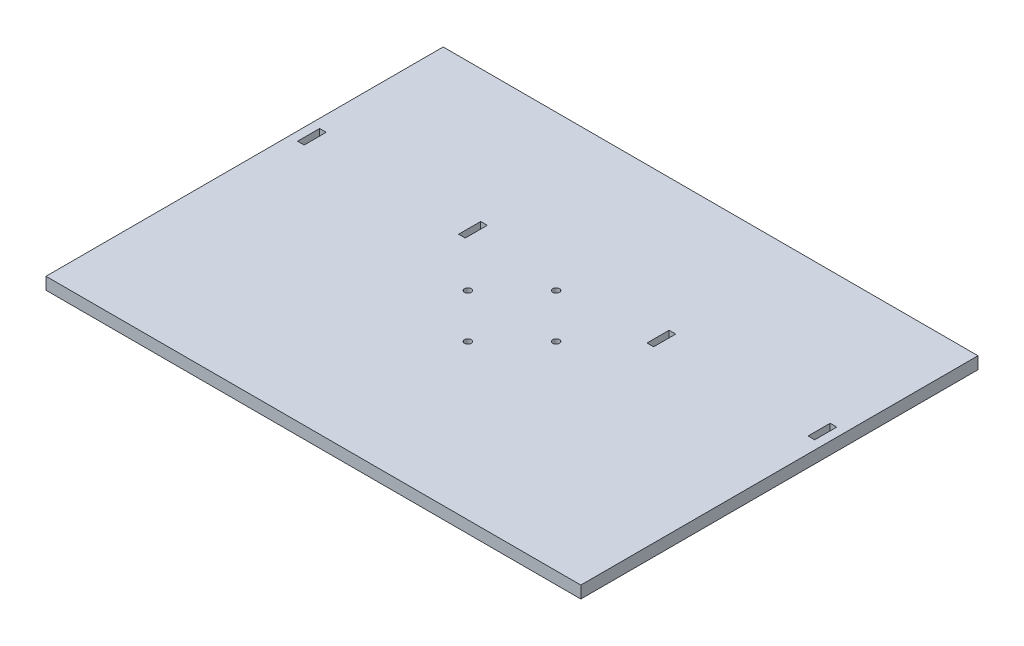
ISO-10303-21;
HEADER;
FILE_DESCRIPTION(('STEP AP214'),'2;1');
FILE_NAME('part.step','',(''),(''),'','','');
FILE_SCHEMA(('AUTOMOTIVE_DESIGN { 1 0 10303 214 1 1 1 1 }'));
ENDSEC;
DATA;
#1=APPLICATION_CONTEXT('core data for automotive mechanical design processes');
#2=APPLICATION_PROTOCOL_DEFINITION('international standard','automotive_design',2000,#1);
#3=PRODUCT_CONTEXT('',#1,'mechanical');
#4=PRODUCT('Part','Part','',(#3));
#5=PRODUCT_RELATED_PRODUCT_CATEGORY('part','',(#4));
#6=PRODUCT_DEFINITION_FORMATION('','',#4);
#7=PRODUCT_DEFINITION_CONTEXT('part definition',#1,'design');
#8=PRODUCT_DEFINITION('design','',#6,#7);
#9=PRODUCT_DEFINITION_SHAPE('','',#8);
#10=(LENGTH_UNIT() NAMED_UNIT(*) SI_UNIT(.MILLI.,.METRE.));
#11=(NAMED_UNIT(*) PLANE_ANGLE_UNIT() SI_UNIT($,.RADIAN.));
#12=(NAMED_UNIT(*) SI_UNIT($,.STERADIAN.) SOLID_ANGLE_UNIT());
#13=UNCERTAINTY_MEASURE_WITH_UNIT(LENGTH_MEASURE(1.E-05),#10,'distance_accuracy_value','');
#14=(GEOMETRIC_REPRESENTATION_CONTEXT(3) GLOBAL_UNCERTAINTY_ASSIGNED_CONTEXT((#13)) GLOBAL_UNIT_ASSIGNED_CONTEXT((#10,
#11,#12)) REPRESENTATION_CONTEXT('',''));
#15=CARTESIAN_POINT('',(0.,0.,0.));
#16=DIRECTION('',(0.,0.,1.));
#17=DIRECTION('',(1.,0.,0.));
#18=AXIS2_PLACEMENT_3D('',#15,#16,#17);
#19=CARTESIAN_POINT('',(0.,11.5,0.));
#20=DIRECTION('',(0.,-1.,0.));
#21=DIRECTION('',(0.,0.,-1.));
#22=AXIS2_PLACEMENT_3D('',#19,#20,#21);
#23=PLANE('',#22);
#24=DIRECTION('',(-1.,0.,0.));
#25=VECTOR('',#24,1.);
#26=CARTESIAN_POINT('',(0.,11.5,-20.));
#27=LINE('',#26,#25);
#28=CARTESIAN_POINT('',(-35.9388175044995,11.5,-20.));
#29=VERTEX_POINT('',#28);
#30=CARTESIAN_POINT('',(-38.9388175044995,11.5,-20.));
#31=VERTEX_POINT('',#30);
#32=EDGE_CURVE('E305',#29,#31,#27,.T.);
#33=ORIENTED_EDGE('',*,*,#32,.T.);
#34=DIRECTION('',(0.,0.,-1.));
#35=VECTOR('',#34,1.);
#36=CARTESIAN_POINT('',(-38.9388175044995,11.5,0.));
#37=LINE('',#36,#35);
#38=CARTESIAN_POINT('',(-38.9388175044995,11.5,-30.));
#39=VERTEX_POINT('',#38);
#40=EDGE_CURVE('E308',#31,#39,#37,.T.);
#41=ORIENTED_EDGE('',*,*,#40,.T.);
#42=DIRECTION('',(1.,0.,0.));
#43=VECTOR('',#42,1.);
#44=CARTESIAN_POINT('',(0.,11.5,-30.));
#45=LINE('',#44,#43);
#46=CARTESIAN_POINT('',(-35.9388175044995,11.5,-30.));
#47=VERTEX_POINT('',#46);
#48=EDGE_CURVE('E302',#39,#47,#45,.T.);
#49=ORIENTED_EDGE('',*,*,#48,.T.);
#50=DIRECTION('',(0.,0.,1.));
#51=VECTOR('',#50,1.);
#52=CARTESIAN_POINT('',(-35.9388175044995,11.5,0.));
#53=LINE('',#52,#51);
#54=EDGE_CURVE('E182',#47,#29,#53,.T.);
#55=ORIENTED_EDGE('',*,*,#54,.T.);
#56=EDGE_LOOP('',(#33,#41,#49,#55));
#57=FACE_BOUND('',#56,.T.);
#58=DIRECTION('',(1.,0.,0.));
#59=VECTOR('',#58,1.);
#60=CARTESIAN_POINT('',(0.,11.5,-30.));
#61=LINE('',#60,#59);
#62=CARTESIAN_POINT('',(119.442719099992,11.5,-30.));
#63=VERTEX_POINT('',#62);
#64=CARTESIAN_POINT('',(122.442719099992,11.5,-30.));
#65=VERTEX_POINT('',#64);
#66=EDGE_CURVE('E296',#63,#65,#61,.T.);
#67=ORIENTED_EDGE('',*,*,#66,.T.);
#68=DIRECTION('',(0.,0.,1.));
#69=VECTOR('',#68,1.);
#70=CARTESIAN_POINT('',(122.442719099992,11.5,0.));
#71=LINE('',#70,#69);
#72=CARTESIAN_POINT('',(122.442719099992,11.5,-20.));
#73=VERTEX_POINT('',#72);
#74=EDGE_CURVE('E299',#65,#73,#71,.T.);
#75=ORIENTED_EDGE('',*,*,#74,.T.);
#76=DIRECTION('',(-1.,0.,0.));
#77=VECTOR('',#76,1.);
#78=CARTESIAN_POINT('',(0.,11.5,-20.));
#79=LINE('',#78,#77);
#80=CARTESIAN_POINT('',(119.442719099992,11.5,-20.));
#81=VERTEX_POINT('',#80);
#82=EDGE_CURVE('E290',#73,#81,#79,.T.);
#83=ORIENTED_EDGE('',*,*,#82,.T.);
#84=DIRECTION('',(0.,0.,-1.));
#85=VECTOR('',#84,1.);
#86=CARTESIAN_POINT('',(119.442719099992,11.5,0.));
#87=LINE('',#86,#85);
#88=EDGE_CURVE('E293',#81,#63,#87,.T.);
#89=ORIENTED_EDGE('',*,*,#88,.T.);
#90=EDGE_LOOP('',(#67,#75,#83,#89));
#91=FACE_BOUND('',#90,.T.);
#92=DIRECTION('',(-1.,0.,0.));
#93=VECTOR('',#92,1.);
#94=CARTESIAN_POINT('',(0.,11.5,-20.));
#95=LINE('',#94,#93);
#96=CARTESIAN_POINT('',(37.0611824955005,11.5,-20.));
#97=VERTEX_POINT('',#96);
#98=CARTESIAN_POINT('',(34.0611824955005,11.5,-20.));
#99=VERTEX_POINT('',#98);
#100=EDGE_CURVE('E284',#97,#99,#95,.T.);
#101=ORIENTED_EDGE('',*,*,#100,.T.);
#102=DIRECTION('',(0.,0.,-1.));
#103=VECTOR('',#102,1.);
#104=CARTESIAN_POINT('',(34.0611824955005,11.5,0.));
#105=LINE('',#104,#103);
#106=CARTESIAN_POINT('',(34.0611824955005,11.5,-30.));
#107=VERTEX_POINT('',#106);
#108=EDGE_CURVE('E287',#99,#107,#105,.T.);
#109=ORIENTED_EDGE('',*,*,#108,.T.);
#110=DIRECTION('',(1.,0.,0.));
#111=VECTOR('',#110,1.);
#112=CARTESIAN_POINT('',(0.,11.5,-29.9999999999999));
#113=LINE('',#112,#111);
#114=CARTESIAN_POINT('',(37.0611824955005,11.5,-30.));
#115=VERTEX_POINT('',#114);
#116=EDGE_CURVE('E278',#107,#115,#113,.T.);
#117=ORIENTED_EDGE('',*,*,#116,.T.);
#118=DIRECTION('',(0.,0.,1.));
#119=VECTOR('',#118,1.);
#120=CARTESIAN_POINT('',(37.0611824955005,11.5,0.));
#121=LINE('',#120,#119);
#122=EDGE_CURVE('E281',#115,#97,#121,.T.);
#123=ORIENTED_EDGE('',*,*,#122,.T.);
#124=EDGE_LOOP('',(#101,#109,#117,#123));
#125=FACE_BOUND('',#124,.T.);
#126=DIRECTION('',(1.,0.,0.));
#127=VECTOR('',#126,1.);
#128=CARTESIAN_POINT('',(0.,11.5,-30.));
#129=LINE('',#128,#127);
#130=CARTESIAN_POINT('',(192.442719099992,11.5,-30.));
#131=VERTEX_POINT('',#130);
#132=CARTESIAN_POINT('',(195.442719099992,11.5,-30.));
#133=VERTEX_POINT('',#132);
#134=EDGE_CURVE('E272',#131,#133,#129,.T.);
#135=ORIENTED_EDGE('',*,*,#134,.T.);
#136=DIRECTION('',(0.,0.,1.));
#137=VECTOR('',#136,1.);
#138=CARTESIAN_POINT('',(195.442719099992,11.5,0.));
#139=LINE('',#138,#137);
#140=CARTESIAN_POINT('',(195.442719099992,11.5,-19.9999999999999));
#141=VERTEX_POINT('',#140);
#142=EDGE_CURVE('E275',#133,#141,#139,.T.);
#143=ORIENTED_EDGE('',*,*,#142,.T.);
#144=DIRECTION('',(-1.,0.,0.));
#145=VECTOR('',#144,1.);
#146=CARTESIAN_POINT('',(0.,11.5,-20.0000000000002));
#147=LINE('',#146,#145);
#148=CARTESIAN_POINT('',(192.442719099992,11.5,-20.));
#149=VERTEX_POINT('',#148);
#150=EDGE_CURVE('E206',#141,#149,#147,.T.);
#151=ORIENTED_EDGE('',*,*,#150,.T.);
#152=DIRECTION('',(0.,0.,-1.));
#153=VECTOR('',#152,1.);
#154=CARTESIAN_POINT('',(192.442719099991,11.5,5.34135844165705E-13));
#155=LINE('',#154,#153);
#156=EDGE_CURVE('E269',#149,#131,#155,.T.);
#157=ORIENTED_EDGE('',*,*,#156,.T.);
#158=EDGE_LOOP('',(#135,#143,#151,#157));
#159=FACE_BOUND('',#158,.T.);
#160=CARTESIAN_POINT('',(98.2519507977461,11.5,0.));
#161=DIRECTION('',(0.,-1.,0.));
#162=DIRECTION('',(0.,0.,-1.));
#163=AXIS2_PLACEMENT_3D('',#160,#161,#162);
#164=CIRCLE('',#163,1.5);
#165=CARTESIAN_POINT('',(98.2519507977461,11.5,-1.5));
#166=VERTEX_POINT('',#165);
#167=EDGE_CURVE('E312',#166,#166,#164,.T.);
#168=ORIENTED_EDGE('',*,*,#167,.T.);
#169=EDGE_LOOP('',(#168));
#170=FACE_BOUND('',#169,.T.);
#171=CARTESIAN_POINT('',(78.251950797746,11.5,-20.));
#172=DIRECTION('',(0.,-1.,0.));
#173=DIRECTION('',(0.,0.,-1.));
#174=AXIS2_PLACEMENT_3D('',#171,#172,#173);
#175=CIRCLE('',#174,1.5);
#176=CARTESIAN_POINT('',(78.251950797746,11.5,-21.5));
#177=VERTEX_POINT('',#176);
#178=EDGE_CURVE('E319',#177,#177,#175,.T.);
#179=ORIENTED_EDGE('',*,*,#178,.T.);
#180=EDGE_LOOP('',(#179));
#181=FACE_BOUND('',#180,.T.);
#182=CARTESIAN_POINT('',(58.2519507977461,11.5,0.));
#183=DIRECTION('',(0.,-1.,0.));
#184=DIRECTION('',(0.,0.,-1.));
#185=AXIS2_PLACEMENT_3D('',#182,#183,#184);
#186=CIRCLE('',#185,1.5);
#187=CARTESIAN_POINT('',(58.2519507977461,11.5,-1.49999999999999));
#188=VERTEX_POINT('',#187);
#189=EDGE_CURVE('E322',#188,#188,#186,.T.);
#190=ORIENTED_EDGE('',*,*,#189,.T.);
#191=EDGE_LOOP('',(#190));
#192=FACE_BOUND('',#191,.T.);
#193=CARTESIAN_POINT('',(78.2519507977461,11.5,20.));
#194=DIRECTION('',(0.,-1.,0.));
#195=DIRECTION('',(0.,0.,-1.));
#196=AXIS2_PLACEMENT_3D('',#193,#194,#195);
#197=CIRCLE('',#196,1.5);
#198=CARTESIAN_POINT('',(78.2519507977461,11.5,18.5));
#199=VERTEX_POINT('',#198);
#200=EDGE_CURVE('E328',#199,#199,#197,.T.);
#201=ORIENTED_EDGE('',*,*,#200,.T.);
#202=EDGE_LOOP('',(#201));
#203=FACE_BOUND('',#202,.T.);
#204=DIRECTION('',(0.,0.,1.));
#205=VECTOR('',#204,1.);
#206=CARTESIAN_POINT('',(-42.9388175044995,11.5,90.));
#207=LINE('',#206,#205);
#208=CARTESIAN_POINT('',(-42.9388175044995,11.5,-90.));
#209=VERTEX_POINT('',#208);
#210=CARTESIAN_POINT('',(-42.9388175044995,11.5,90.));
#211=VERTEX_POINT('',#210);
#212=EDGE_CURVE('E336',#209,#211,#207,.T.);
#213=ORIENTED_EDGE('',*,*,#212,.T.);
#214=DIRECTION('',(1.,0.,0.));
#215=VECTOR('',#214,1.);
#216=CARTESIAN_POINT('',(-42.9388175044995,11.5,90.));
#217=LINE('',#216,#215);
#218=CARTESIAN_POINT('',(199.442719099992,11.5,90.));
#219=VERTEX_POINT('',#218);
#220=EDGE_CURVE('E339',#211,#219,#217,.T.);
#221=ORIENTED_EDGE('',*,*,#220,.T.);
#222=DIRECTION('',(0.,0.,-1.));
#223=VECTOR('',#222,1.);
#224=CARTESIAN_POINT('',(199.442719099992,11.5,90.));
#225=LINE('',#224,#223);
#226=CARTESIAN_POINT('',(199.442719099992,11.5,-90.));
#227=VERTEX_POINT('',#226);
#228=EDGE_CURVE('E342',#219,#227,#225,.T.);
#229=ORIENTED_EDGE('',*,*,#228,.T.);
#230=DIRECTION('',(-1.,0.,0.));
#231=VECTOR('',#230,1.);
#232=CARTESIAN_POINT('',(-42.9388175044995,11.5,-90.));
#233=LINE('',#232,#231);
#234=EDGE_CURVE('E344',#227,#209,#233,.T.);
#235=ORIENTED_EDGE('',*,*,#234,.T.);
#236=EDGE_LOOP('',(#213,#221,#229,#235));
#237=FACE_BOUND('',#236,.T.);
#238=ADVANCED_FACE('F40',(#57,#91,#125,#159,#170,#181,#192,#203,#237),#23,.F.);
#239=CARTESIAN_POINT('',(-42.9388175044995,11.5,-90.));
#240=DIRECTION('',(0.,0.,1.));
#241=DIRECTION('',(1.,0.,0.));
#242=AXIS2_PLACEMENT_3D('',#239,#240,#241);
#243=PLANE('',#242);
#244=DIRECTION('',(-1.,0.,0.));
#245=VECTOR('',#244,1.);
#246=CARTESIAN_POINT('',(-42.9388175044995,6.,-90.));
#247=LINE('',#246,#245);
#248=CARTESIAN_POINT('',(199.442719099992,6.,-90.));
#249=VERTEX_POINT('',#248);
#250=CARTESIAN_POINT('',(-42.9388175044995,6.,-90.));
#251=VERTEX_POINT('',#250);
#252=EDGE_CURVE('E340',#249,#251,#247,.T.);
#253=ORIENTED_EDGE('',*,*,#252,.T.);
#254=DIRECTION('',(0.,-1.,0.));
#255=VECTOR('',#254,1.);
#256=CARTESIAN_POINT('',(-42.9388175044995,11.5,-90.));
#257=LINE('',#256,#255);
#258=EDGE_CURVE('E345',#209,#251,#257,.T.);
#259=ORIENTED_EDGE('',*,*,#258,.F.);
#260=ORIENTED_EDGE('',*,*,#234,.F.);
#261=DIRECTION('',(0.,-1.,0.));
#262=VECTOR('',#261,1.);
#263=CARTESIAN_POINT('',(199.442719099992,11.5,-90.));
#264=LINE('',#263,#262);
#265=EDGE_CURVE('E353',#227,#249,#264,.T.);
#266=ORIENTED_EDGE('',*,*,#265,.T.);
#267=EDGE_LOOP('',(#253,#259,#260,#266));
#268=FACE_BOUND('',#267,.T.);
#269=ADVANCED_FACE('F377',(#268),#243,.F.);
#270=CARTESIAN_POINT('',(199.442719099992,11.5,90.));
#271=DIRECTION('',(-1.,0.,0.));
#272=DIRECTION('',(0.,0.,1.));
#273=AXIS2_PLACEMENT_3D('',#270,#271,#272);
#274=PLANE('',#273);
#275=DIRECTION('',(0.,0.,-1.));
#276=VECTOR('',#275,1.);
#277=CARTESIAN_POINT('',(199.442719099992,6.,90.));
#278=LINE('',#277,#276);
#279=CARTESIAN_POINT('',(199.442719099992,6.,90.));
#280=VERTEX_POINT('',#279);
#281=EDGE_CURVE('E348',#280,#249,#278,.T.);
#282=ORIENTED_EDGE('',*,*,#281,.T.);
#283=ORIENTED_EDGE('',*,*,#265,.F.);
#284=ORIENTED_EDGE('',*,*,#228,.F.);
#285=DIRECTION('',(0.,-1.,0.));
#286=VECTOR('',#285,1.);
#287=CARTESIAN_POINT('',(199.442719099992,11.5,90.));
#288=LINE('',#287,#286);
#289=EDGE_CURVE('E355',#219,#280,#288,.T.);
#290=ORIENTED_EDGE('',*,*,#289,.T.);
#291=EDGE_LOOP('',(#282,#283,#284,#290));
#292=FACE_BOUND('',#291,.T.);
#293=ADVANCED_FACE('F374',(#292),#274,.F.);
#294=CARTESIAN_POINT('',(-42.9388175044995,11.5,90.));
#295=DIRECTION('',(0.,0.,-1.));
#296=DIRECTION('',(-1.,0.,0.));
#297=AXIS2_PLACEMENT_3D('',#294,#295,#296);
#298=PLANE('',#297);
#299=DIRECTION('',(1.,0.,0.));
#300=VECTOR('',#299,1.);
#301=CARTESIAN_POINT('',(-42.9388175044995,6.,90.));
#302=LINE('',#301,#300);
#303=CARTESIAN_POINT('',(-42.9388175044995,6.,90.));
#304=VERTEX_POINT('',#303);
#305=EDGE_CURVE('E315',#304,#280,#302,.T.);
#306=ORIENTED_EDGE('',*,*,#305,.T.);
#307=ORIENTED_EDGE('',*,*,#289,.F.);
#308=ORIENTED_EDGE('',*,*,#220,.F.);
#309=DIRECTION('',(0.,-1.,0.));
#310=VECTOR('',#309,1.);
#311=CARTESIAN_POINT('',(-42.9388175044995,11.5,90.));
#312=LINE('',#311,#310);
#313=EDGE_CURVE('E44',#211,#304,#312,.T.);
#314=ORIENTED_EDGE('',*,*,#313,.T.);
#315=EDGE_LOOP('',(#306,#307,#308,#314));
#316=FACE_BOUND('',#315,.T.);
#317=ADVANCED_FACE('F364',(#316),#298,.F.);
#318=CARTESIAN_POINT('',(-42.9388175044995,11.5,90.));
#319=DIRECTION('',(1.,0.,0.));
#320=DIRECTION('',(0.,0.,-1.));
#321=AXIS2_PLACEMENT_3D('',#318,#319,#320);
#322=PLANE('',#321);
#323=ORIENTED_EDGE('',*,*,#258,.T.);
#324=DIRECTION('',(0.,0.,1.));
#325=VECTOR('',#324,1.);
#326=CARTESIAN_POINT('',(-42.9388175044995,6.,90.));
#327=LINE('',#326,#325);
#328=EDGE_CURVE('E11',#251,#304,#327,.T.);
#329=ORIENTED_EDGE('',*,*,#328,.T.);
#330=ORIENTED_EDGE('',*,*,#313,.F.);
#331=ORIENTED_EDGE('',*,*,#212,.F.);
#332=EDGE_LOOP('',(#323,#329,#330,#331));
#333=FACE_BOUND('',#332,.T.);
#334=ADVANCED_FACE('F42',(#333),#322,.F.);
#335=CARTESIAN_POINT('',(0.,6.,0.));
#336=DIRECTION('',(0.,-1.,0.));
#337=DIRECTION('',(0.,0.,-1.));
#338=AXIS2_PLACEMENT_3D('',#335,#336,#337);
#339=PLANE('',#338);
#340=DIRECTION('',(0.,0.,-1.));
#341=VECTOR('',#340,1.);
#342=CARTESIAN_POINT('',(-38.9388175044995,6.,-20.));
#343=LINE('',#342,#341);
#344=CARTESIAN_POINT('',(-38.9388175044995,6.,-20.));
#345=VERTEX_POINT('',#344);
#346=CARTESIAN_POINT('',(-38.9388175044995,6.,-30.));
#347=VERTEX_POINT('',#346);
#348=EDGE_CURVE('E194',#345,#347,#343,.T.);
#349=ORIENTED_EDGE('',*,*,#348,.F.);
#350=DIRECTION('',(-1.,0.,0.));
#351=VECTOR('',#350,1.);
#352=CARTESIAN_POINT('',(-38.9388175044995,6.,-20.));
#353=LINE('',#352,#351);
#354=CARTESIAN_POINT('',(-35.9388175044995,6.,-20.));
#355=VERTEX_POINT('',#354);
#356=EDGE_CURVE('E199',#355,#345,#353,.T.);
#357=ORIENTED_EDGE('',*,*,#356,.F.);
#358=DIRECTION('',(0.,0.,1.));
#359=VECTOR('',#358,1.);
#360=CARTESIAN_POINT('',(-35.9388175044995,6.,-20.));
#361=LINE('',#360,#359);
#362=CARTESIAN_POINT('',(-35.9388175044995,6.,-30.));
#363=VERTEX_POINT('',#362);
#364=EDGE_CURVE('E179',#363,#355,#361,.T.);
#365=ORIENTED_EDGE('',*,*,#364,.F.);
#366=DIRECTION('',(1.,0.,0.));
#367=VECTOR('',#366,1.);
#368=CARTESIAN_POINT('',(-38.9388175044995,6.,-30.));
#369=LINE('',#368,#367);
#370=EDGE_CURVE('E189',#347,#363,#369,.T.);
#371=ORIENTED_EDGE('',*,*,#370,.F.);
#372=EDGE_LOOP('',(#349,#357,#365,#371));
#373=FACE_BOUND('',#372,.T.);
#374=DIRECTION('',(0.,0.,1.));
#375=VECTOR('',#374,1.);
#376=CARTESIAN_POINT('',(122.442719099992,6.,-30.));
#377=LINE('',#376,#375);
#378=CARTESIAN_POINT('',(122.442719099992,6.,-30.));
#379=VERTEX_POINT('',#378);
#380=CARTESIAN_POINT('',(122.442719099992,6.,-20.));
#381=VERTEX_POINT('',#380);
#382=EDGE_CURVE('E209',#379,#381,#377,.T.);
#383=ORIENTED_EDGE('',*,*,#382,.F.);
#384=DIRECTION('',(1.,0.,0.));
#385=VECTOR('',#384,1.);
#386=CARTESIAN_POINT('',(122.442719099992,6.,-30.));
#387=LINE('',#386,#385);
#388=CARTESIAN_POINT('',(119.442719099992,6.,-30.));
#389=VERTEX_POINT('',#388);
#390=EDGE_CURVE('E216',#389,#379,#387,.T.);
#391=ORIENTED_EDGE('',*,*,#390,.F.);
#392=DIRECTION('',(0.,0.,-1.));
#393=VECTOR('',#392,1.);
#394=CARTESIAN_POINT('',(119.442719099992,6.,-30.));
#395=LINE('',#394,#393);
#396=CARTESIAN_POINT('',(119.442719099992,6.,-20.));
#397=VERTEX_POINT('',#396);
#398=EDGE_CURVE('E213',#397,#389,#395,.T.);
#399=ORIENTED_EDGE('',*,*,#398,.F.);
#400=DIRECTION('',(-1.,0.,0.));
#401=VECTOR('',#400,1.);
#402=CARTESIAN_POINT('',(122.442719099992,6.,-20.));
#403=LINE('',#402,#401);
#404=EDGE_CURVE('E211',#381,#397,#403,.T.);
#405=ORIENTED_EDGE('',*,*,#404,.F.);
#406=EDGE_LOOP('',(#383,#391,#399,#405));
#407=FACE_BOUND('',#406,.T.);
#408=DIRECTION('',(0.,0.,-1.));
#409=VECTOR('',#408,1.);
#410=CARTESIAN_POINT('',(34.0611824955005,6.,-30.));
#411=LINE('',#410,#409);
#412=CARTESIAN_POINT('',(34.0611824955005,6.,-20.));
#413=VERTEX_POINT('',#412);
#414=CARTESIAN_POINT('',(34.0611824955005,6.,-30.));
#415=VERTEX_POINT('',#414);
#416=EDGE_CURVE('E222',#413,#415,#411,.T.);
#417=ORIENTED_EDGE('',*,*,#416,.F.);
#418=DIRECTION('',(-1.,0.,0.));
#419=VECTOR('',#418,1.);
#420=CARTESIAN_POINT('',(34.0611824955005,6.,-20.));
#421=LINE('',#420,#419);
#422=CARTESIAN_POINT('',(37.0611824955005,6.,-20.));
#423=VERTEX_POINT('',#422);
#424=EDGE_CURVE('E256',#423,#413,#421,.T.);
#425=ORIENTED_EDGE('',*,*,#424,.F.);
#426=DIRECTION('',(0.,0.,1.));
#427=VECTOR('',#426,1.);
#428=CARTESIAN_POINT('',(37.0611824955005,6.,-30.));
#429=LINE('',#428,#427);
#430=CARTESIAN_POINT('',(37.0611824955005,6.,-30.));
#431=VERTEX_POINT('',#430);
#432=EDGE_CURVE('E253',#431,#423,#429,.T.);
#433=ORIENTED_EDGE('',*,*,#432,.F.);
#434=DIRECTION('',(1.,0.,0.));
#435=VECTOR('',#434,1.);
#436=CARTESIAN_POINT('',(34.0611824955005,6.,-30.));
#437=LINE('',#436,#435);
#438=EDGE_CURVE('E250',#415,#431,#437,.T.);
#439=ORIENTED_EDGE('',*,*,#438,.F.);
#440=EDGE_LOOP('',(#417,#425,#433,#439));
#441=FACE_BOUND('',#440,.T.);
#442=DIRECTION('',(0.,0.,1.));
#443=VECTOR('',#442,1.);
#444=CARTESIAN_POINT('',(195.442719099992,6.,-30.));
#445=LINE('',#444,#443);
#446=CARTESIAN_POINT('',(195.442719099992,6.,-30.));
#447=VERTEX_POINT('',#446);
#448=CARTESIAN_POINT('',(195.442719099992,6.,-19.9999999999999));
#449=VERTEX_POINT('',#448);
#450=EDGE_CURVE('E228',#447,#449,#445,.T.);
#451=ORIENTED_EDGE('',*,*,#450,.F.);
#452=DIRECTION('',(1.,0.,0.));
#453=VECTOR('',#452,1.);
#454=CARTESIAN_POINT('',(195.442719099992,6.,-30.));
#455=LINE('',#454,#453);
#456=CARTESIAN_POINT('',(192.442719099992,6.,-30.));
#457=VERTEX_POINT('',#456);
#458=EDGE_CURVE('E237',#457,#447,#455,.T.);
#459=ORIENTED_EDGE('',*,*,#458,.F.);
#460=DIRECTION('',(0.,0.,-1.));
#461=VECTOR('',#460,1.);
#462=CARTESIAN_POINT('',(192.442719099992,6.,-30.));
#463=LINE('',#462,#461);
#464=CARTESIAN_POINT('',(192.442719099992,6.,-20.));
#465=VERTEX_POINT('',#464);
#466=EDGE_CURVE('E234',#465,#457,#463,.T.);
#467=ORIENTED_EDGE('',*,*,#466,.F.);
#468=DIRECTION('',(-1.,0.,0.));
#469=VECTOR('',#468,1.);
#470=CARTESIAN_POINT('',(195.442719099992,6.,-19.9999999999999));
#471=LINE('',#470,#469);
#472=EDGE_CURVE('E230',#449,#465,#471,.T.);
#473=ORIENTED_EDGE('',*,*,#472,.F.);
#474=EDGE_LOOP('',(#451,#459,#467,#473));
#475=FACE_BOUND('',#474,.T.);
#476=ORIENTED_EDGE('',*,*,#328,.F.);
#477=ORIENTED_EDGE('',*,*,#252,.F.);
#478=ORIENTED_EDGE('',*,*,#281,.F.);
#479=ORIENTED_EDGE('',*,*,#305,.F.);
#480=EDGE_LOOP('',(#476,#477,#478,#479));
#481=FACE_BOUND('',#480,.T.);
#482=CARTESIAN_POINT('',(98.2519507977461,6.,0.));
#483=DIRECTION('',(0.,-1.,0.));
#484=DIRECTION('',(0.,0.,-1.));
#485=AXIS2_PLACEMENT_3D('',#482,#483,#484);
#486=CIRCLE('',#485,1.5);
#487=CARTESIAN_POINT('',(98.2519507977461,6.,-1.5));
#488=VERTEX_POINT('',#487);
#489=EDGE_CURVE('E316',#488,#488,#486,.T.);
#490=ORIENTED_EDGE('',*,*,#489,.F.);
#491=EDGE_LOOP('',(#490));
#492=FACE_BOUND('',#491,.T.);
#493=CARTESIAN_POINT('',(78.2519507977461,6.,20.));
#494=DIRECTION('',(0.,-1.,0.));
#495=DIRECTION('',(0.,0.,-1.));
#496=AXIS2_PLACEMENT_3D('',#493,#494,#495);
#497=CIRCLE('',#496,1.5);
#498=CARTESIAN_POINT('',(78.2519507977461,6.,18.5));
#499=VERTEX_POINT('',#498);
#500=EDGE_CURVE('E331',#499,#499,#497,.T.);
#501=ORIENTED_EDGE('',*,*,#500,.F.);
#502=EDGE_LOOP('',(#501));
#503=FACE_BOUND('',#502,.T.);
#504=CARTESIAN_POINT('',(58.2519507977461,6.,0.));
#505=DIRECTION('',(0.,-1.,0.));
#506=DIRECTION('',(0.,0.,-1.));
#507=AXIS2_PLACEMENT_3D('',#504,#505,#506);
#508=CIRCLE('',#507,1.5);
#509=CARTESIAN_POINT('',(58.2519507977461,6.,-1.49999999999999));
#510=VERTEX_POINT('',#509);
#511=EDGE_CURVE('E325',#510,#510,#508,.T.);
#512=ORIENTED_EDGE('',*,*,#511,.F.);
#513=EDGE_LOOP('',(#512));
#514=FACE_BOUND('',#513,.T.);
#515=CARTESIAN_POINT('',(78.251950797746,6.,-20.));
#516=DIRECTION('',(0.,-1.,0.));
#517=DIRECTION('',(0.,0.,-1.));
#518=AXIS2_PLACEMENT_3D('',#515,#516,#517);
#519=CIRCLE('',#518,1.5);
#520=CARTESIAN_POINT('',(78.251950797746,6.,-21.5));
#521=VERTEX_POINT('',#520);
#522=EDGE_CURVE('E311',#521,#521,#519,.T.);
#523=ORIENTED_EDGE('',*,*,#522,.F.);
#524=EDGE_LOOP('',(#523));
#525=FACE_BOUND('',#524,.T.);
#526=ADVANCED_FACE('F196',(#373,#407,#441,#475,#481,#492,#503,#514,#525),#339,.T.);
#527=CARTESIAN_POINT('',(98.2519507977461,11.5,0.));
#528=DIRECTION('',(0.,-1.,0.));
#529=DIRECTION('',(0.,0.,-1.));
#530=AXIS2_PLACEMENT_3D('',#527,#528,#529);
#531=CYLINDRICAL_SURFACE('',#530,1.5);
#532=ORIENTED_EDGE('',*,*,#167,.F.);
#533=EDGE_LOOP('',(#532));
#534=FACE_BOUND('',#533,.T.);
#535=ORIENTED_EDGE('',*,*,#489,.T.);
#536=EDGE_LOOP('',(#535));
#537=FACE_BOUND('',#536,.T.);
#538=ADVANCED_FACE('F392',(#534,#537),#531,.F.);
#539=CARTESIAN_POINT('',(78.2519507977461,11.5,20.));
#540=DIRECTION('',(0.,-1.,0.));
#541=DIRECTION('',(0.,0.,-1.));
#542=AXIS2_PLACEMENT_3D('',#539,#540,#541);
#543=CYLINDRICAL_SURFACE('',#542,1.5);
#544=ORIENTED_EDGE('',*,*,#200,.F.);
#545=EDGE_LOOP('',(#544));
#546=FACE_BOUND('',#545,.T.);
#547=ORIENTED_EDGE('',*,*,#500,.T.);
#548=EDGE_LOOP('',(#547));
#549=FACE_BOUND('',#548,.T.);
#550=ADVANCED_FACE('F389',(#546,#549),#543,.F.);
#551=CARTESIAN_POINT('',(58.2519507977461,11.5,0.));
#552=DIRECTION('',(0.,-1.,0.));
#553=DIRECTION('',(0.,0.,-1.));
#554=AXIS2_PLACEMENT_3D('',#551,#552,#553);
#555=CYLINDRICAL_SURFACE('',#554,1.5);
#556=ORIENTED_EDGE('',*,*,#189,.F.);
#557=EDGE_LOOP('',(#556));
#558=FACE_BOUND('',#557,.T.);
#559=ORIENTED_EDGE('',*,*,#511,.T.);
#560=EDGE_LOOP('',(#559));
#561=FACE_BOUND('',#560,.T.);
#562=ADVANCED_FACE('F420',(#558,#561),#555,.F.);
#563=CARTESIAN_POINT('',(78.251950797746,11.5,-20.));
#564=DIRECTION('',(0.,-1.,0.));
#565=DIRECTION('',(0.,0.,-1.));
#566=AXIS2_PLACEMENT_3D('',#563,#564,#565);
#567=CYLINDRICAL_SURFACE('',#566,1.5);
#568=ORIENTED_EDGE('',*,*,#178,.F.);
#569=EDGE_LOOP('',(#568));
#570=FACE_BOUND('',#569,.T.);
#571=ORIENTED_EDGE('',*,*,#522,.T.);
#572=EDGE_LOOP('',(#571));
#573=FACE_BOUND('',#572,.T.);
#574=ADVANCED_FACE('F427',(#570,#573),#567,.F.);
#575=CARTESIAN_POINT('',(195.442719099992,12.,-30.));
#576=DIRECTION('',(1.,0.,0.));
#577=DIRECTION('',(0.,0.,-1.));
#578=AXIS2_PLACEMENT_3D('',#575,#576,#577);
#579=PLANE('',#578);
#580=DIRECTION('',(0.,-1.,0.));
#581=VECTOR('',#580,1.);
#582=CARTESIAN_POINT('',(195.442719099992,12.,-30.));
#583=LINE('',#582,#581);
#584=EDGE_CURVE('E241',#133,#447,#583,.T.);
#585=ORIENTED_EDGE('',*,*,#584,.T.);
#586=ORIENTED_EDGE('',*,*,#450,.T.);
#587=DIRECTION('',(0.,-1.,0.));
#588=VECTOR('',#587,1.);
#589=CARTESIAN_POINT('',(195.442719099992,12.,-19.9999999999999));
#590=LINE('',#589,#588);
#591=EDGE_CURVE('E240',#141,#449,#590,.T.);
#592=ORIENTED_EDGE('',*,*,#591,.F.);
#593=ORIENTED_EDGE('',*,*,#142,.F.);
#594=EDGE_LOOP('',(#585,#586,#592,#593));
#595=FACE_BOUND('',#594,.T.);
#596=ADVANCED_FACE('F434',(#595),#579,.F.);
#597=CARTESIAN_POINT('',(195.442719099992,12.,-30.));
#598=DIRECTION('',(0.,0.,-1.));
#599=DIRECTION('',(-1.,0.,0.));
#600=AXIS2_PLACEMENT_3D('',#597,#598,#599);
#601=PLANE('',#600);
#602=DIRECTION('',(0.,-1.,0.));
#603=VECTOR('',#602,1.);
#604=CARTESIAN_POINT('',(192.442719099992,12.,-30.));
#605=LINE('',#604,#603);
#606=EDGE_CURVE('E243',#131,#457,#605,.T.);
#607=ORIENTED_EDGE('',*,*,#606,.T.);
#608=ORIENTED_EDGE('',*,*,#458,.T.);
#609=ORIENTED_EDGE('',*,*,#584,.F.);
#610=ORIENTED_EDGE('',*,*,#134,.F.);
#611=EDGE_LOOP('',(#607,#608,#609,#610));
#612=FACE_BOUND('',#611,.T.);
#613=ADVANCED_FACE('F442',(#612),#601,.F.);
#614=CARTESIAN_POINT('',(192.442719099992,12.,-30.));
#615=DIRECTION('',(-1.,0.,0.));
#616=DIRECTION('',(0.,0.,1.));
#617=AXIS2_PLACEMENT_3D('',#614,#615,#616);
#618=PLANE('',#617);
#619=DIRECTION('',(0.,-1.,0.));
#620=VECTOR('',#619,1.);
#621=CARTESIAN_POINT('',(192.442719099992,12.,-20.));
#622=LINE('',#621,#620);
#623=EDGE_CURVE('E245',#149,#465,#622,.T.);
#624=ORIENTED_EDGE('',*,*,#623,.T.);
#625=ORIENTED_EDGE('',*,*,#466,.T.);
#626=ORIENTED_EDGE('',*,*,#606,.F.);
#627=ORIENTED_EDGE('',*,*,#156,.F.);
#628=EDGE_LOOP('',(#624,#625,#626,#627));
#629=FACE_BOUND('',#628,.T.);
#630=ADVANCED_FACE('F450',(#629),#618,.F.);
#631=CARTESIAN_POINT('',(195.442719099992,12.,-19.9999999999999));
#632=DIRECTION('',(0.,0.,1.));
#633=DIRECTION('',(1.,0.,0.));
#634=AXIS2_PLACEMENT_3D('',#631,#632,#633);
#635=PLANE('',#634);
#636=ORIENTED_EDGE('',*,*,#591,.T.);
#637=ORIENTED_EDGE('',*,*,#472,.T.);
#638=ORIENTED_EDGE('',*,*,#623,.F.);
#639=ORIENTED_EDGE('',*,*,#150,.F.);
#640=EDGE_LOOP('',(#636,#637,#638,#639));
#641=FACE_BOUND('',#640,.T.);
#642=ADVANCED_FACE('F458',(#641),#635,.F.);
#643=CARTESIAN_POINT('',(34.0611824955005,12.,-30.));
#644=DIRECTION('',(-1.,0.,0.));
#645=DIRECTION('',(0.,0.,1.));
#646=AXIS2_PLACEMENT_3D('',#643,#644,#645);
#647=PLANE('',#646);
#648=DIRECTION('',(0.,-1.,0.));
#649=VECTOR('',#648,1.);
#650=CARTESIAN_POINT('',(34.0611824955005,12.,-20.));
#651=LINE('',#650,#649);
#652=EDGE_CURVE('E231',#99,#413,#651,.T.);
#653=ORIENTED_EDGE('',*,*,#652,.T.);
#654=ORIENTED_EDGE('',*,*,#416,.T.);
#655=DIRECTION('',(0.,-1.,0.));
#656=VECTOR('',#655,1.);
#657=CARTESIAN_POINT('',(34.0611824955005,12.,-30.));
#658=LINE('',#657,#656);
#659=EDGE_CURVE('E259',#107,#415,#658,.T.);
#660=ORIENTED_EDGE('',*,*,#659,.F.);
#661=ORIENTED_EDGE('',*,*,#108,.F.);
#662=EDGE_LOOP('',(#653,#654,#660,#661));
#663=FACE_BOUND('',#662,.T.);
#664=ADVANCED_FACE('F466',(#663),#647,.F.);
#665=CARTESIAN_POINT('',(34.0611824955005,12.,-20.));
#666=DIRECTION('',(0.,0.,1.));
#667=DIRECTION('',(1.,0.,0.));
#668=AXIS2_PLACEMENT_3D('',#665,#666,#667);
#669=PLANE('',#668);
#670=DIRECTION('',(0.,-1.,0.));
#671=VECTOR('',#670,1.);
#672=CARTESIAN_POINT('',(37.0611824955005,12.,-20.));
#673=LINE('',#672,#671);
#674=EDGE_CURVE('E261',#97,#423,#673,.T.);
#675=ORIENTED_EDGE('',*,*,#674,.T.);
#676=ORIENTED_EDGE('',*,*,#424,.T.);
#677=ORIENTED_EDGE('',*,*,#652,.F.);
#678=ORIENTED_EDGE('',*,*,#100,.F.);
#679=EDGE_LOOP('',(#675,#676,#677,#678));
#680=FACE_BOUND('',#679,.T.);
#681=ADVANCED_FACE('F474',(#680),#669,.F.);
#682=CARTESIAN_POINT('',(37.0611824955005,12.,-30.));
#683=DIRECTION('',(1.,0.,0.));
#684=DIRECTION('',(0.,0.,-1.));
#685=AXIS2_PLACEMENT_3D('',#682,#683,#684);
#686=PLANE('',#685);
#687=DIRECTION('',(0.,-1.,0.));
#688=VECTOR('',#687,1.);
#689=CARTESIAN_POINT('',(37.0611824955005,12.,-30.));
#690=LINE('',#689,#688);
#691=EDGE_CURVE('E263',#115,#431,#690,.T.);
#692=ORIENTED_EDGE('',*,*,#691,.T.);
#693=ORIENTED_EDGE('',*,*,#432,.T.);
#694=ORIENTED_EDGE('',*,*,#674,.F.);
#695=ORIENTED_EDGE('',*,*,#122,.F.);
#696=EDGE_LOOP('',(#692,#693,#694,#695));
#697=FACE_BOUND('',#696,.T.);
#698=ADVANCED_FACE('F482',(#697),#686,.F.);
#699=CARTESIAN_POINT('',(34.0611824955005,12.,-30.));
#700=DIRECTION('',(0.,0.,-1.));
#701=DIRECTION('',(-1.,0.,0.));
#702=AXIS2_PLACEMENT_3D('',#699,#700,#701);
#703=PLANE('',#702);
#704=ORIENTED_EDGE('',*,*,#659,.T.);
#705=ORIENTED_EDGE('',*,*,#438,.T.);
#706=ORIENTED_EDGE('',*,*,#691,.F.);
#707=ORIENTED_EDGE('',*,*,#116,.F.);
#708=EDGE_LOOP('',(#704,#705,#706,#707));
#709=FACE_BOUND('',#708,.T.);
#710=ADVANCED_FACE('F490',(#709),#703,.F.);
#711=CARTESIAN_POINT('',(122.442719099992,12.,-30.));
#712=DIRECTION('',(1.,0.,0.));
#713=DIRECTION('',(0.,0.,-1.));
#714=AXIS2_PLACEMENT_3D('',#711,#712,#713);
#715=PLANE('',#714);
#716=DIRECTION('',(0.,-1.,0.));
#717=VECTOR('',#716,1.);
#718=CARTESIAN_POINT('',(122.442719099992,12.,-30.));
#719=LINE('',#718,#717);
#720=EDGE_CURVE('E220',#65,#379,#719,.T.);
#721=ORIENTED_EDGE('',*,*,#720,.T.);
#722=ORIENTED_EDGE('',*,*,#382,.T.);
#723=DIRECTION('',(0.,-1.,0.));
#724=VECTOR('',#723,1.);
#725=CARTESIAN_POINT('',(122.442719099992,12.,-20.));
#726=LINE('',#725,#724);
#727=EDGE_CURVE('E219',#73,#381,#726,.T.);
#728=ORIENTED_EDGE('',*,*,#727,.F.);
#729=ORIENTED_EDGE('',*,*,#74,.F.);
#730=EDGE_LOOP('',(#721,#722,#728,#729));
#731=FACE_BOUND('',#730,.T.);
#732=ADVANCED_FACE('F498',(#731),#715,.F.);
#733=CARTESIAN_POINT('',(122.442719099992,12.,-30.));
#734=DIRECTION('',(0.,0.,-1.));
#735=DIRECTION('',(-1.,0.,0.));
#736=AXIS2_PLACEMENT_3D('',#733,#734,#735);
#737=PLANE('',#736);
#738=DIRECTION('',(0.,-1.,0.));
#739=VECTOR('',#738,1.);
#740=CARTESIAN_POINT('',(119.442719099992,12.,-30.));
#741=LINE('',#740,#739);
#742=EDGE_CURVE('E223',#63,#389,#741,.T.);
#743=ORIENTED_EDGE('',*,*,#742,.T.);
#744=ORIENTED_EDGE('',*,*,#390,.T.);
#745=ORIENTED_EDGE('',*,*,#720,.F.);
#746=ORIENTED_EDGE('',*,*,#66,.F.);
#747=EDGE_LOOP('',(#743,#744,#745,#746));
#748=FACE_BOUND('',#747,.T.);
#749=ADVANCED_FACE('F506',(#748),#737,.F.);
#750=CARTESIAN_POINT('',(119.442719099992,12.,-30.));
#751=DIRECTION('',(-1.,0.,0.));
#752=DIRECTION('',(0.,0.,1.));
#753=AXIS2_PLACEMENT_3D('',#750,#751,#752);
#754=PLANE('',#753);
#755=DIRECTION('',(0.,-1.,0.));
#756=VECTOR('',#755,1.);
#757=CARTESIAN_POINT('',(119.442719099992,12.,-20.));
#758=LINE('',#757,#756);
#759=EDGE_CURVE('E64',#81,#397,#758,.T.);
#760=ORIENTED_EDGE('',*,*,#759,.T.);
#761=ORIENTED_EDGE('',*,*,#398,.T.);
#762=ORIENTED_EDGE('',*,*,#742,.F.);
#763=ORIENTED_EDGE('',*,*,#88,.F.);
#764=EDGE_LOOP('',(#760,#761,#762,#763));
#765=FACE_BOUND('',#764,.T.);
#766=ADVANCED_FACE('F514',(#765),#754,.F.);
#767=CARTESIAN_POINT('',(122.442719099992,12.,-20.));
#768=DIRECTION('',(0.,0.,1.));
#769=DIRECTION('',(1.,0.,0.));
#770=AXIS2_PLACEMENT_3D('',#767,#768,#769);
#771=PLANE('',#770);
#772=ORIENTED_EDGE('',*,*,#727,.T.);
#773=ORIENTED_EDGE('',*,*,#404,.T.);
#774=ORIENTED_EDGE('',*,*,#759,.F.);
#775=ORIENTED_EDGE('',*,*,#82,.F.);
#776=EDGE_LOOP('',(#772,#773,#774,#775));
#777=FACE_BOUND('',#776,.T.);
#778=ADVANCED_FACE('F522',(#777),#771,.F.);
#779=CARTESIAN_POINT('',(-38.9388175044995,12.,-20.));
#780=DIRECTION('',(-1.,0.,0.));
#781=DIRECTION('',(0.,0.,1.));
#782=AXIS2_PLACEMENT_3D('',#779,#780,#781);
#783=PLANE('',#782);
#784=DIRECTION('',(0.,-1.,0.));
#785=VECTOR('',#784,1.);
#786=CARTESIAN_POINT('',(-38.9388175044995,12.,-20.));
#787=LINE('',#786,#785);
#788=EDGE_CURVE('E204',#31,#345,#787,.T.);
#789=ORIENTED_EDGE('',*,*,#788,.T.);
#790=ORIENTED_EDGE('',*,*,#348,.T.);
#791=DIRECTION('',(0.,-1.,0.));
#792=VECTOR('',#791,1.);
#793=CARTESIAN_POINT('',(-38.9388175044995,12.,-30.));
#794=LINE('',#793,#792);
#795=EDGE_CURVE('E185',#39,#347,#794,.T.);
#796=ORIENTED_EDGE('',*,*,#795,.F.);
#797=ORIENTED_EDGE('',*,*,#40,.F.);
#798=EDGE_LOOP('',(#789,#790,#796,#797));
#799=FACE_BOUND('',#798,.T.);
#800=ADVANCED_FACE('F530',(#799),#783,.F.);
#801=CARTESIAN_POINT('',(-38.9388175044995,12.,-20.));
#802=DIRECTION('',(0.,0.,1.));
#803=DIRECTION('',(1.,0.,0.));
#804=AXIS2_PLACEMENT_3D('',#801,#802,#803);
#805=PLANE('',#804);
#806=DIRECTION('',(0.,-1.,0.));
#807=VECTOR('',#806,1.);
#808=CARTESIAN_POINT('',(-35.9388175044995,12.,-20.));
#809=LINE('',#808,#807);
#810=EDGE_CURVE('E184',#29,#355,#809,.T.);
#811=ORIENTED_EDGE('',*,*,#810,.T.);
#812=ORIENTED_EDGE('',*,*,#356,.T.);
#813=ORIENTED_EDGE('',*,*,#788,.F.);
#814=ORIENTED_EDGE('',*,*,#32,.F.);
#815=EDGE_LOOP('',(#811,#812,#813,#814));
#816=FACE_BOUND('',#815,.T.);
#817=ADVANCED_FACE('F537',(#816),#805,.F.);
#818=CARTESIAN_POINT('',(-35.9388175044995,12.,-20.));
#819=DIRECTION('',(1.,0.,0.));
#820=DIRECTION('',(0.,0.,-1.));
#821=AXIS2_PLACEMENT_3D('',#818,#819,#820);
#822=PLANE('',#821);
#823=DIRECTION('',(0.,-1.,0.));
#824=VECTOR('',#823,1.);
#825=CARTESIAN_POINT('',(-35.9388175044995,12.,-30.));
#826=LINE('',#825,#824);
#827=EDGE_CURVE('E56',#47,#363,#826,.T.);
#828=ORIENTED_EDGE('',*,*,#827,.T.);
#829=ORIENTED_EDGE('',*,*,#364,.T.);
#830=ORIENTED_EDGE('',*,*,#810,.F.);
#831=ORIENTED_EDGE('',*,*,#54,.F.);
#832=EDGE_LOOP('',(#828,#829,#830,#831));
#833=FACE_BOUND('',#832,.T.);
#834=ADVANCED_FACE('F176',(#833),#822,.F.);
#835=CARTESIAN_POINT('',(-38.9388175044995,12.,-30.));
#836=DIRECTION('',(0.,0.,-1.));
#837=DIRECTION('',(-1.,0.,0.));
#838=AXIS2_PLACEMENT_3D('',#835,#836,#837);
#839=PLANE('',#838);
#840=ORIENTED_EDGE('',*,*,#795,.T.);
#841=ORIENTED_EDGE('',*,*,#370,.T.);
#842=ORIENTED_EDGE('',*,*,#827,.F.);
#843=ORIENTED_EDGE('',*,*,#48,.F.);
#844=EDGE_LOOP('',(#840,#841,#842,#843));
#845=FACE_BOUND('',#844,.T.);
#846=ADVANCED_FACE('F190',(#845),#839,.F.);
#847=CLOSED_SHELL('',(#238,#269,#293,#317,#334,#526,#538,#550,#562,#574,#596,#613,#630,#642,
#664,#681,#698,#710,#732,#749,#766,#778,#800,#817,#834,#846));
#848=MANIFOLD_SOLID_BREP('B2',#847);
#849=ADVANCED_BREP_SHAPE_REPRESENTATION('',(#18,#848),#14);
#850=SHAPE_DEFINITION_REPRESENTATION(#9,#849);
ENDSEC;
END-ISO-10303-21;
